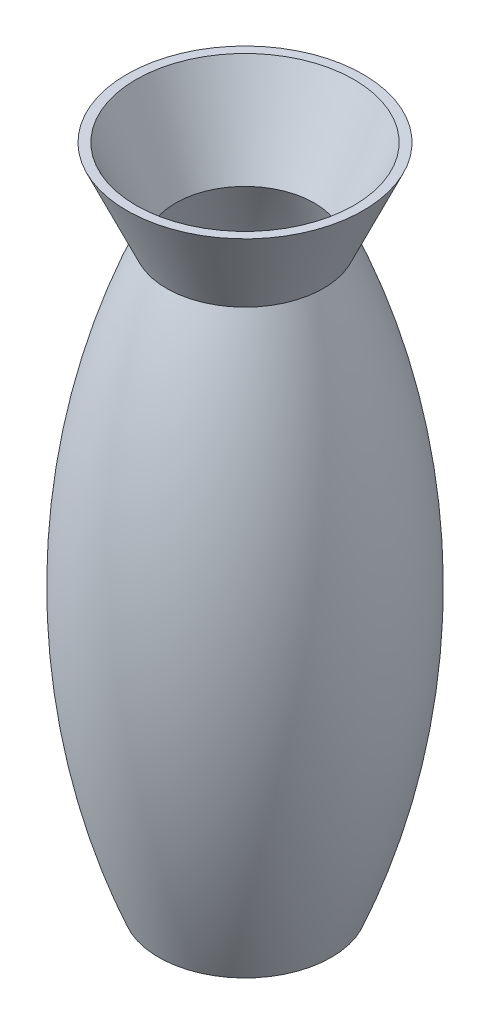
ISO-10303-21;
HEADER;
FILE_DESCRIPTION(('STEP AP214'),'2;1');
FILE_NAME('part.step','',(''),(''),'','','');
FILE_SCHEMA(('AUTOMOTIVE_DESIGN { 1 0 10303 214 1 1 1 1 }'));
ENDSEC;
DATA;
#1=APPLICATION_CONTEXT('core data for automotive mechanical design processes');
#2=APPLICATION_PROTOCOL_DEFINITION('international standard','automotive_design',2000,#1);
#3=PRODUCT_CONTEXT('',#1,'mechanical');
#4=PRODUCT('Part','Part','',(#3));
#5=PRODUCT_RELATED_PRODUCT_CATEGORY('part','',(#4));
#6=PRODUCT_DEFINITION_FORMATION('','',#4);
#7=PRODUCT_DEFINITION_CONTEXT('part definition',#1,'design');
#8=PRODUCT_DEFINITION('design','',#6,#7);
#9=PRODUCT_DEFINITION_SHAPE('','',#8);
#10=(LENGTH_UNIT() NAMED_UNIT(*) SI_UNIT(.MILLI.,.METRE.));
#11=(NAMED_UNIT(*) PLANE_ANGLE_UNIT() SI_UNIT($,.RADIAN.));
#12=(NAMED_UNIT(*) SI_UNIT($,.STERADIAN.) SOLID_ANGLE_UNIT());
#13=UNCERTAINTY_MEASURE_WITH_UNIT(LENGTH_MEASURE(1.E-05),#10,'distance_accuracy_value','');
#14=(GEOMETRIC_REPRESENTATION_CONTEXT(3) GLOBAL_UNCERTAINTY_ASSIGNED_CONTEXT((#13)) GLOBAL_UNIT_ASSIGNED_CONTEXT((#10,
#11,#12)) REPRESENTATION_CONTEXT('',''));
#15=CARTESIAN_POINT('',(0.,0.,0.));
#16=DIRECTION('',(0.,0.,1.));
#17=DIRECTION('',(1.,0.,0.));
#18=AXIS2_PLACEMENT_3D('',#15,#16,#17);
#19=CARTESIAN_POINT('',(0.,114.791792001262,0.));
#20=DIRECTION('',(0.,1.,0.));
#21=DIRECTION('',(-1.,0.,0.));
#22=AXIS2_PLACEMENT_3D('',#19,#20,#21);
#23=PLANE('',#22);
#24=CARTESIAN_POINT('',(0.,114.791792001262,0.));
#25=DIRECTION('',(0.,1.,0.));
#26=DIRECTION('',(-1.,0.,0.));
#27=AXIS2_PLACEMENT_3D('',#24,#25,#26);
#28=CIRCLE('',#27,33.4368380356174);
#29=CARTESIAN_POINT('',(-33.4368380356174,114.791792001262,0.));
#30=VERTEX_POINT('',#29);
#31=EDGE_CURVE('E56',#30,#30,#28,.T.);
#32=ORIENTED_EDGE('',*,*,#31,.F.);
#33=EDGE_LOOP('',(#32));
#34=FACE_BOUND('',#33,.T.);
#35=CARTESIAN_POINT('',(0.,114.791792001262,0.));
#36=DIRECTION('',(0.,1.,0.));
#37=DIRECTION('',(-1.,0.,0.));
#38=AXIS2_PLACEMENT_3D('',#35,#36,#37);
#39=CIRCLE('',#38,36.2269231967928);
#40=CARTESIAN_POINT('',(-36.2269231967928,114.791792001262,0.));
#41=VERTEX_POINT('',#40);
#42=EDGE_CURVE('E10',#41,#41,#39,.T.);
#43=ORIENTED_EDGE('',*,*,#42,.T.);
#44=EDGE_LOOP('',(#43));
#45=FACE_BOUND('',#44,.T.);
#46=ADVANCED_FACE('F39',(#34,#45),#23,.T.);
#47=CARTESIAN_POINT('',(0.,114.791792001262,0.));
#48=DIRECTION('',(0.,1.,0.));
#49=DIRECTION('',(-1.,0.,0.));
#50=AXIS2_PLACEMENT_3D('',#47,#48,#49);
#51=CONICAL_SURFACE('',#50,36.2269231967928,0.426627493126876);
#52=CARTESIAN_POINT('',(0.,88.0475620947656,0.));
#53=DIRECTION('',(0.,1.,0.));
#54=DIRECTION('',(-1.,0.,0.));
#55=AXIS2_PLACEMENT_3D('',#52,#53,#54);
#56=CIRCLE('',#55,24.0704550574761);
#57=CARTESIAN_POINT('',(-24.0704550574761,88.0475620947656,0.));
#58=VERTEX_POINT('',#57);
#59=EDGE_CURVE('E46',#58,#58,#56,.T.);
#60=ORIENTED_EDGE('',*,*,#59,.T.);
#61=EDGE_LOOP('',(#60));
#62=FACE_BOUND('',#61,.T.);
#63=ORIENTED_EDGE('',*,*,#42,.F.);
#64=EDGE_LOOP('',(#63));
#65=FACE_BOUND('',#64,.T.);
#66=ADVANCED_FACE('F81',(#62,#65),#51,.T.);
#67=CARTESIAN_POINT('',(0.,-3.08975257989447,0.));
#68=DIRECTION('',(0.,1.,0.));
#69=DIRECTION('',(-1.,0.,0.));
#70=AXIS2_PLACEMENT_3D('',#67,#68,#69);
#71=DEGENERATE_TOROIDAL_SURFACE('',#70,185.871299950363,228.870161056175,.F.);
#72=CARTESIAN_POINT('',(0.,-88.4082079987375,0.));
#73=DIRECTION('',(0.,1.,0.));
#74=DIRECTION('',(-1.,0.,0.));
#75=AXIS2_PLACEMENT_3D('',#72,#73,#74);
#76=CIRCLE('',#75,26.5017486853394);
#77=CARTESIAN_POINT('',(-26.5017486853394,-88.4082079987375,0.));
#78=VERTEX_POINT('',#77);
#79=EDGE_CURVE('E51',#78,#78,#76,.T.);
#80=ORIENTED_EDGE('',*,*,#79,.T.);
#81=EDGE_LOOP('',(#80));
#82=FACE_BOUND('',#81,.T.);
#83=ORIENTED_EDGE('',*,*,#59,.F.);
#84=EDGE_LOOP('',(#83));
#85=FACE_BOUND('',#84,.T.);
#86=ADVANCED_FACE('F85',(#82,#85),#71,.F.);
#87=CARTESIAN_POINT('',(0.,-88.4082079987375,0.));
#88=DIRECTION('',(0.,-1.,0.));
#89=DIRECTION('',(1.,0.,0.));
#90=AXIS2_PLACEMENT_3D('',#87,#88,#89);
#91=PLANE('',#90);
#92=ORIENTED_EDGE('',*,*,#79,.F.);
#93=EDGE_LOOP('',(#92));
#94=FACE_BOUND('',#93,.T.);
#95=ADVANCED_FACE('F76',(#94),#91,.T.);
#96=CARTESIAN_POINT('',(0.,115.842851479787,0.));
#97=DIRECTION('',(0.,1.,0.));
#98=DIRECTION('',(-1.,0.,0.));
#99=AXIS2_PLACEMENT_3D('',#96,#97,#98);
#100=CONICAL_SURFACE('',#99,33.9145923440378,0.426627493126876);
#101=CARTESIAN_POINT('',(0.,88.0678453542215,0.));
#102=DIRECTION('',(0.,-1.,0.));
#103=DIRECTION('',(1.,0.,0.));
#104=AXIS2_PLACEMENT_3D('',#101,#102,#103);
#105=CIRCLE('',#104,21.2895895596896);
#106=CARTESIAN_POINT('',(21.2895895596897,88.0678453542215,0.));
#107=VERTEX_POINT('',#106);
#108=EDGE_CURVE('E62',#107,#107,#105,.F.);
#109=ORIENTED_EDGE('',*,*,#108,.F.);
#110=EDGE_LOOP('',(#109));
#111=FACE_BOUND('',#110,.T.);
#112=ORIENTED_EDGE('',*,*,#31,.T.);
#113=EDGE_LOOP('',(#112));
#114=FACE_BOUND('',#113,.T.);
#115=ADVANCED_FACE('F73',(#111,#114),#100,.F.);
#116=CARTESIAN_POINT('',(0.,-3.08975257989447,0.));
#117=DIRECTION('',(0.,1.,0.));
#118=DIRECTION('',(-1.,0.,0.));
#119=AXIS2_PLACEMENT_3D('',#116,#117,#118);
#120=DEGENERATE_TOROIDAL_SURFACE('',#119,185.871299950363,226.330161056175,.F.);
#121=CARTESIAN_POINT('',(0.,-85.8682079987375,0.));
#122=DIRECTION('',(0.,-1.,0.));
#123=DIRECTION('',(1.,0.,0.));
#124=AXIS2_PLACEMENT_3D('',#121,#122,#123);
#125=CIRCLE('',#124,24.7778612684389);
#126=CARTESIAN_POINT('',(24.7778612684389,-85.8682079987375,0.));
#127=VERTEX_POINT('',#126);
#128=EDGE_CURVE('E63',#127,#127,#125,.F.);
#129=ORIENTED_EDGE('',*,*,#128,.F.);
#130=EDGE_LOOP('',(#129));
#131=FACE_BOUND('',#130,.T.);
#132=ORIENTED_EDGE('',*,*,#108,.T.);
#133=EDGE_LOOP('',(#132));
#134=FACE_BOUND('',#133,.T.);
#135=ADVANCED_FACE('F71',(#131,#134),#120,.T.);
#136=CARTESIAN_POINT('',(0.,-85.8682079987375,0.));
#137=DIRECTION('',(0.,-1.,0.));
#138=DIRECTION('',(1.,0.,0.));
#139=AXIS2_PLACEMENT_3D('',#136,#137,#138);
#140=PLANE('',#139);
#141=ORIENTED_EDGE('',*,*,#128,.T.);
#142=EDGE_LOOP('',(#141));
#143=FACE_BOUND('',#142,.T.);
#144=ADVANCED_FACE('F96',(#143),#140,.F.);
#145=CLOSED_SHELL('',(#46,#66,#86,#95,#115,#135,#144));
#146=MANIFOLD_SOLID_BREP('B2',#145);
#147=ADVANCED_BREP_SHAPE_REPRESENTATION('',(#18,#146),#14);
#148=SHAPE_DEFINITION_REPRESENTATION(#9,#147);
ENDSEC;
END-ISO-10303-21;
